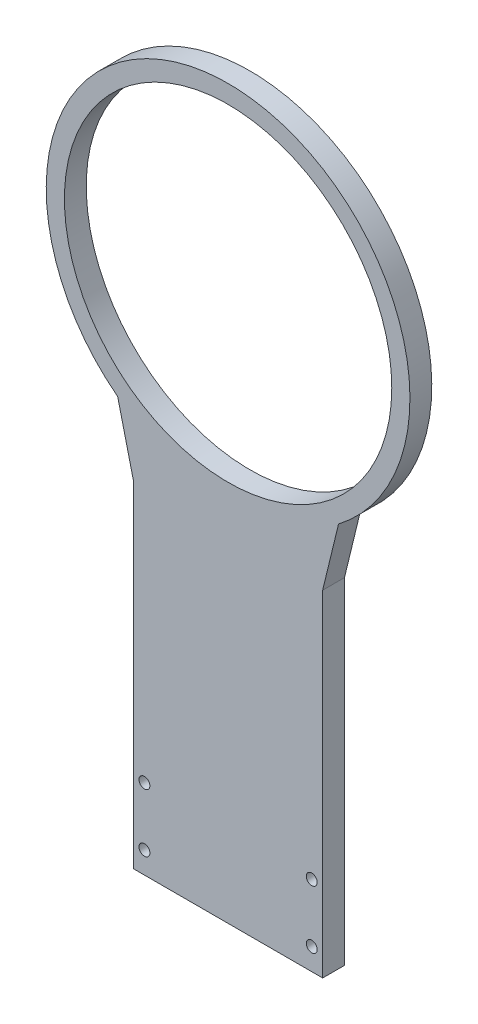
ISO-10303-21;
HEADER;
FILE_DESCRIPTION(('STEP AP214'),'2;1');
FILE_NAME('part.step','',(''),(''),'','','');
FILE_SCHEMA(('AUTOMOTIVE_DESIGN { 1 0 10303 214 1 1 1 1 }'));
ENDSEC;
DATA;
#1=APPLICATION_CONTEXT('core data for automotive mechanical design processes');
#2=APPLICATION_PROTOCOL_DEFINITION('international standard','automotive_design',2000,#1);
#3=PRODUCT_CONTEXT('',#1,'mechanical');
#4=PRODUCT('Part','Part','',(#3));
#5=PRODUCT_RELATED_PRODUCT_CATEGORY('part','',(#4));
#6=PRODUCT_DEFINITION_FORMATION('','',#4);
#7=PRODUCT_DEFINITION_CONTEXT('part definition',#1,'design');
#8=PRODUCT_DEFINITION('design','',#6,#7);
#9=PRODUCT_DEFINITION_SHAPE('','',#8);
#10=(LENGTH_UNIT() NAMED_UNIT(*) SI_UNIT(.MILLI.,.METRE.));
#11=(NAMED_UNIT(*) PLANE_ANGLE_UNIT() SI_UNIT($,.RADIAN.));
#12=(NAMED_UNIT(*) SI_UNIT($,.STERADIAN.) SOLID_ANGLE_UNIT());
#13=UNCERTAINTY_MEASURE_WITH_UNIT(LENGTH_MEASURE(1.E-05),#10,'distance_accuracy_value','');
#14=(GEOMETRIC_REPRESENTATION_CONTEXT(3) GLOBAL_UNCERTAINTY_ASSIGNED_CONTEXT((#13)) GLOBAL_UNIT_ASSIGNED_CONTEXT((#10,
#11,#12)) REPRESENTATION_CONTEXT('',''));
#15=CARTESIAN_POINT('',(0.,0.,0.));
#16=DIRECTION('',(0.,0.,1.));
#17=DIRECTION('',(1.,0.,0.));
#18=AXIS2_PLACEMENT_3D('',#15,#16,#17);
#19=CARTESIAN_POINT('',(0.,0.,6.));
#20=DIRECTION('',(0.,0.,-1.));
#21=DIRECTION('',(-1.,0.,0.));
#22=AXIS2_PLACEMENT_3D('',#19,#20,#21);
#23=PLANE('',#22);
#24=CARTESIAN_POINT('',(27.,-94.,6.));
#25=DIRECTION('',(0.,0.,1.));
#26=DIRECTION('',(1.,0.,0.));
#27=AXIS2_PLACEMENT_3D('',#24,#25,#26);
#28=CIRCLE('',#27,1.5);
#29=CARTESIAN_POINT('',(28.5,-94.,6.));
#30=VERTEX_POINT('',#29);
#31=EDGE_CURVE('E275',#30,#30,#28,.T.);
#32=ORIENTED_EDGE('',*,*,#31,.F.);
#33=EDGE_LOOP('',(#32));
#34=FACE_BOUND('',#33,.T.);
#35=CARTESIAN_POINT('',(73.,-94.,6.));
#36=DIRECTION('',(0.,0.,1.));
#37=DIRECTION('',(-1.,0.,0.));
#38=AXIS2_PLACEMENT_3D('',#35,#36,#37);
#39=CIRCLE('',#38,1.49999999999998);
#40=CARTESIAN_POINT('',(71.5,-94.,6.));
#41=VERTEX_POINT('',#40);
#42=EDGE_CURVE('E281',#41,#41,#39,.T.);
#43=ORIENTED_EDGE('',*,*,#42,.F.);
#44=EDGE_LOOP('',(#43));
#45=FACE_BOUND('',#44,.T.);
#46=CARTESIAN_POINT('',(73.,-78.,6.));
#47=DIRECTION('',(0.,0.,1.));
#48=DIRECTION('',(-1.,0.,0.));
#49=AXIS2_PLACEMENT_3D('',#46,#47,#48);
#50=CIRCLE('',#49,1.5);
#51=CARTESIAN_POINT('',(71.5,-78.,6.));
#52=VERTEX_POINT('',#51);
#53=EDGE_CURVE('E289',#52,#52,#50,.T.);
#54=ORIENTED_EDGE('',*,*,#53,.F.);
#55=EDGE_LOOP('',(#54));
#56=FACE_BOUND('',#55,.T.);
#57=CARTESIAN_POINT('',(27.,-78.,6.));
#58=DIRECTION('',(0.,0.,1.));
#59=DIRECTION('',(1.,0.,0.));
#60=AXIS2_PLACEMENT_3D('',#57,#58,#59);
#61=CIRCLE('',#60,1.5);
#62=CARTESIAN_POINT('',(28.5,-78.,6.));
#63=VERTEX_POINT('',#62);
#64=EDGE_CURVE('E278',#63,#63,#61,.T.);
#65=ORIENTED_EDGE('',*,*,#64,.F.);
#66=EDGE_LOOP('',(#65));
#67=FACE_BOUND('',#66,.T.);
#68=CARTESIAN_POINT('',(50.,50.,6.));
#69=DIRECTION('',(0.,0.,1.));
#70=DIRECTION('',(1.,0.,0.));
#71=AXIS2_PLACEMENT_3D('',#68,#69,#70);
#72=CIRCLE('',#71,45.);
#73=CARTESIAN_POINT('',(95.,50.,6.));
#74=VERTEX_POINT('',#73);
#75=EDGE_CURVE('E105',#74,#74,#72,.T.);
#76=ORIENTED_EDGE('',*,*,#75,.F.);
#77=EDGE_LOOP('',(#76));
#78=FACE_BOUND('',#77,.T.);
#79=CARTESIAN_POINT('',(50.,50.,6.));
#80=DIRECTION('',(0.,0.,-1.));
#81=DIRECTION('',(-1.,0.,0.));
#82=AXIS2_PLACEMENT_3D('',#79,#80,#81);
#83=CIRCLE('',#82,50.);
#84=CARTESIAN_POINT('',(19.6357645656102,10.2757856404315,6.));
#85=VERTEX_POINT('',#84);
#86=CARTESIAN_POINT('',(80.3642354343898,10.2757856404315,6.));
#87=VERTEX_POINT('',#86);
#88=EDGE_CURVE('E132',#85,#87,#83,.T.);
#89=ORIENTED_EDGE('',*,*,#88,.F.);
#90=DIRECTION('',(0.236291228604651,-0.971682281038666,0.));
#91=VECTOR('',#90,1.);
#92=CARTESIAN_POINT('',(20.8987506097563,5.08210508130589,6.));
#93=LINE('',#92,#91);
#94=CARTESIAN_POINT('',(24.,-7.67092472592289,6.));
#95=VERTEX_POINT('',#94);
#96=EDGE_CURVE('E126',#85,#95,#93,.T.);
#97=ORIENTED_EDGE('',*,*,#96,.T.);
#98=DIRECTION('',(0.,1.,0.));
#99=VECTOR('',#98,1.);
#100=CARTESIAN_POINT('',(24.,-100.,6.));
#101=LINE('',#100,#99);
#102=CARTESIAN_POINT('',(24.,-100.,6.));
#103=VERTEX_POINT('',#102);
#104=EDGE_CURVE('E100',#103,#95,#101,.T.);
#105=ORIENTED_EDGE('',*,*,#104,.F.);
#106=DIRECTION('',(1.,0.,0.));
#107=VECTOR('',#106,1.);
#108=CARTESIAN_POINT('',(0.,-100.,6.));
#109=LINE('',#108,#107);
#110=CARTESIAN_POINT('',(76.,-100.,6.));
#111=VERTEX_POINT('',#110);
#112=EDGE_CURVE('E106',#103,#111,#109,.T.);
#113=ORIENTED_EDGE('',*,*,#112,.T.);
#114=DIRECTION('',(0.,-1.,0.));
#115=VECTOR('',#114,1.);
#116=CARTESIAN_POINT('',(76.,-100.,6.));
#117=LINE('',#116,#115);
#118=CARTESIAN_POINT('',(76.,-7.67092472592279,6.));
#119=VERTEX_POINT('',#118);
#120=EDGE_CURVE('E92',#119,#111,#117,.T.);
#121=ORIENTED_EDGE('',*,*,#120,.F.);
#122=DIRECTION('',(0.23629122860465,0.971682281038666,0.));
#123=VECTOR('',#122,1.);
#124=CARTESIAN_POINT('',(73.5178949186942,-17.8778949186936,6.));
#125=LINE('',#124,#123);
#126=EDGE_CURVE('E41',#119,#87,#125,.T.);
#127=ORIENTED_EDGE('',*,*,#126,.T.);
#128=EDGE_LOOP('',(#89,#97,#105,#113,#121,#127));
#129=FACE_BOUND('',#128,.T.);
#130=ADVANCED_FACE('F33',(#34,#45,#56,#67,#78,#129),#23,.F.);
#131=CARTESIAN_POINT('',(0.,0.,0.));
#132=DIRECTION('',(0.,0.,-1.));
#133=DIRECTION('',(-1.,0.,0.));
#134=AXIS2_PLACEMENT_3D('',#131,#132,#133);
#135=PLANE('',#134);
#136=DIRECTION('',(0.,1.,0.));
#137=VECTOR('',#136,1.);
#138=CARTESIAN_POINT('',(24.,-100.,0.));
#139=LINE('',#138,#137);
#140=CARTESIAN_POINT('',(24.,-100.,0.));
#141=VERTEX_POINT('',#140);
#142=CARTESIAN_POINT('',(24.,-7.67092472592289,0.));
#143=VERTEX_POINT('',#142);
#144=EDGE_CURVE('E298',#141,#143,#139,.T.);
#145=ORIENTED_EDGE('',*,*,#144,.T.);
#146=DIRECTION('',(-0.236291228604651,0.971682281038666,0.));
#147=VECTOR('',#146,1.);
#148=CARTESIAN_POINT('',(19.6357645656102,10.2757856404315,0.));
#149=LINE('',#148,#147);
#150=CARTESIAN_POINT('',(19.6357645656102,10.2757856404315,0.));
#151=VERTEX_POINT('',#150);
#152=EDGE_CURVE('E128',#143,#151,#149,.T.);
#153=ORIENTED_EDGE('',*,*,#152,.T.);
#154=CARTESIAN_POINT('',(50.,50.,0.));
#155=DIRECTION('',(0.,0.,-1.));
#156=DIRECTION('',(-1.,0.,0.));
#157=AXIS2_PLACEMENT_3D('',#154,#155,#156);
#158=CIRCLE('',#157,50.);
#159=CARTESIAN_POINT('',(80.3642354343898,10.2757856404315,0.));
#160=VERTEX_POINT('',#159);
#161=EDGE_CURVE('E137',#151,#160,#158,.T.);
#162=ORIENTED_EDGE('',*,*,#161,.T.);
#163=DIRECTION('',(-0.23629122860465,-0.971682281038666,0.));
#164=VECTOR('',#163,1.);
#165=CARTESIAN_POINT('',(76.,-7.6709247259228,0.));
#166=LINE('',#165,#164);
#167=CARTESIAN_POINT('',(76.,-7.67092472592279,0.));
#168=VERTEX_POINT('',#167);
#169=EDGE_CURVE('E11',#160,#168,#166,.T.);
#170=ORIENTED_EDGE('',*,*,#169,.T.);
#171=DIRECTION('',(0.,-1.,0.));
#172=VECTOR('',#171,1.);
#173=CARTESIAN_POINT('',(76.,-100.,0.));
#174=LINE('',#173,#172);
#175=CARTESIAN_POINT('',(76.,-100.,0.));
#176=VERTEX_POINT('',#175);
#177=EDGE_CURVE('E83',#168,#176,#174,.T.);
#178=ORIENTED_EDGE('',*,*,#177,.T.);
#179=DIRECTION('',(1.,0.,0.));
#180=VECTOR('',#179,1.);
#181=CARTESIAN_POINT('',(0.,-100.,0.));
#182=LINE('',#181,#180);
#183=EDGE_CURVE('E89',#141,#176,#182,.T.);
#184=ORIENTED_EDGE('',*,*,#183,.F.);
#185=EDGE_LOOP('',(#145,#153,#162,#170,#178,#184));
#186=FACE_BOUND('',#185,.T.);
#187=CARTESIAN_POINT('',(27.,-94.,0.));
#188=DIRECTION('',(0.,0.,1.));
#189=DIRECTION('',(1.,0.,0.));
#190=AXIS2_PLACEMENT_3D('',#187,#188,#189);
#191=CIRCLE('',#190,1.5);
#192=CARTESIAN_POINT('',(28.5,-94.,0.));
#193=VERTEX_POINT('',#192);
#194=EDGE_CURVE('E273',#193,#193,#191,.T.);
#195=ORIENTED_EDGE('',*,*,#194,.T.);
#196=EDGE_LOOP('',(#195));
#197=FACE_BOUND('',#196,.T.);
#198=CARTESIAN_POINT('',(73.,-94.,0.));
#199=DIRECTION('',(0.,0.,1.));
#200=DIRECTION('',(-1.,0.,0.));
#201=AXIS2_PLACEMENT_3D('',#198,#199,#200);
#202=CIRCLE('',#201,1.49999999999998);
#203=CARTESIAN_POINT('',(71.5,-94.,0.));
#204=VERTEX_POINT('',#203);
#205=EDGE_CURVE('E276',#204,#204,#202,.T.);
#206=ORIENTED_EDGE('',*,*,#205,.T.);
#207=EDGE_LOOP('',(#206));
#208=FACE_BOUND('',#207,.T.);
#209=CARTESIAN_POINT('',(73.,-78.,0.));
#210=DIRECTION('',(0.,0.,1.));
#211=DIRECTION('',(-1.,0.,0.));
#212=AXIS2_PLACEMENT_3D('',#209,#210,#211);
#213=CIRCLE('',#212,1.5);
#214=CARTESIAN_POINT('',(71.5,-78.,0.));
#215=VERTEX_POINT('',#214);
#216=EDGE_CURVE('E286',#215,#215,#213,.T.);
#217=ORIENTED_EDGE('',*,*,#216,.T.);
#218=EDGE_LOOP('',(#217));
#219=FACE_BOUND('',#218,.T.);
#220=CARTESIAN_POINT('',(27.,-78.,0.));
#221=DIRECTION('',(0.,0.,1.));
#222=DIRECTION('',(1.,0.,0.));
#223=AXIS2_PLACEMENT_3D('',#220,#221,#222);
#224=CIRCLE('',#223,1.5);
#225=CARTESIAN_POINT('',(28.5,-78.,0.));
#226=VERTEX_POINT('',#225);
#227=EDGE_CURVE('E292',#226,#226,#224,.T.);
#228=ORIENTED_EDGE('',*,*,#227,.T.);
#229=EDGE_LOOP('',(#228));
#230=FACE_BOUND('',#229,.T.);
#231=CARTESIAN_POINT('',(50.,50.,0.));
#232=DIRECTION('',(0.,0.,1.));
#233=DIRECTION('',(1.,0.,0.));
#234=AXIS2_PLACEMENT_3D('',#231,#232,#233);
#235=CIRCLE('',#234,45.);
#236=CARTESIAN_POINT('',(95.,50.,0.));
#237=VERTEX_POINT('',#236);
#238=EDGE_CURVE('E109',#237,#237,#235,.T.);
#239=ORIENTED_EDGE('',*,*,#238,.T.);
#240=EDGE_LOOP('',(#239));
#241=FACE_BOUND('',#240,.T.);
#242=ADVANCED_FACE('F86',(#186,#197,#208,#219,#230,#241),#135,.T.);
#243=CARTESIAN_POINT('',(50.,50.,0.));
#244=DIRECTION('',(0.,0.,1.));
#245=DIRECTION('',(1.,0.,0.));
#246=AXIS2_PLACEMENT_3D('',#243,#244,#245);
#247=CYLINDRICAL_SURFACE('',#246,45.);
#248=ORIENTED_EDGE('',*,*,#238,.F.);
#249=EDGE_LOOP('',(#248));
#250=FACE_BOUND('',#249,.T.);
#251=ORIENTED_EDGE('',*,*,#75,.T.);
#252=EDGE_LOOP('',(#251));
#253=FACE_BOUND('',#252,.T.);
#254=ADVANCED_FACE('F151',(#250,#253),#247,.F.);
#255=CARTESIAN_POINT('',(0.,-100.,0.));
#256=DIRECTION('',(0.,-1.,0.));
#257=DIRECTION('',(0.,0.,-1.));
#258=AXIS2_PLACEMENT_3D('',#255,#256,#257);
#259=PLANE('',#258);
#260=DIRECTION('',(0.,0.,1.));
#261=VECTOR('',#260,1.);
#262=CARTESIAN_POINT('',(76.,-100.,0.));
#263=LINE('',#262,#261);
#264=EDGE_CURVE('E91',#176,#111,#263,.T.);
#265=ORIENTED_EDGE('',*,*,#264,.T.);
#266=ORIENTED_EDGE('',*,*,#112,.F.);
#267=DIRECTION('',(0.,0.,1.));
#268=VECTOR('',#267,1.);
#269=CARTESIAN_POINT('',(24.,-100.,0.));
#270=LINE('',#269,#268);
#271=EDGE_CURVE('E104',#141,#103,#270,.T.);
#272=ORIENTED_EDGE('',*,*,#271,.F.);
#273=ORIENTED_EDGE('',*,*,#183,.T.);
#274=EDGE_LOOP('',(#265,#266,#272,#273));
#275=FACE_BOUND('',#274,.T.);
#276=ADVANCED_FACE('F103',(#275),#259,.T.);
#277=CARTESIAN_POINT('',(24.,-100.,0.));
#278=DIRECTION('',(1.,0.,0.));
#279=DIRECTION('',(0.,0.,-1.));
#280=AXIS2_PLACEMENT_3D('',#277,#278,#279);
#281=PLANE('',#280);
#282=ORIENTED_EDGE('',*,*,#104,.T.);
#283=DIRECTION('',(0.,0.,-1.));
#284=VECTOR('',#283,1.);
#285=CARTESIAN_POINT('',(24.,-7.67092472592289,0.));
#286=LINE('',#285,#284);
#287=EDGE_CURVE('E122',#95,#143,#286,.T.);
#288=ORIENTED_EDGE('',*,*,#287,.T.);
#289=ORIENTED_EDGE('',*,*,#144,.F.);
#290=ORIENTED_EDGE('',*,*,#271,.T.);
#291=EDGE_LOOP('',(#282,#288,#289,#290));
#292=FACE_BOUND('',#291,.T.);
#293=ADVANCED_FACE('F161',(#292),#281,.F.);
#294=CARTESIAN_POINT('',(76.,-100.,0.));
#295=DIRECTION('',(-1.,0.,0.));
#296=DIRECTION('',(0.,0.,1.));
#297=AXIS2_PLACEMENT_3D('',#294,#295,#296);
#298=PLANE('',#297);
#299=ORIENTED_EDGE('',*,*,#177,.F.);
#300=DIRECTION('',(0.,0.,1.));
#301=VECTOR('',#300,1.);
#302=CARTESIAN_POINT('',(76.,-7.6709247259228,6.));
#303=LINE('',#302,#301);
#304=EDGE_CURVE('E124',#168,#119,#303,.T.);
#305=ORIENTED_EDGE('',*,*,#304,.T.);
#306=ORIENTED_EDGE('',*,*,#120,.T.);
#307=ORIENTED_EDGE('',*,*,#264,.F.);
#308=EDGE_LOOP('',(#299,#305,#306,#307));
#309=FACE_BOUND('',#308,.T.);
#310=ADVANCED_FACE('F95',(#309),#298,.F.);
#311=CARTESIAN_POINT('',(27.,-78.,0.));
#312=DIRECTION('',(0.,0.,1.));
#313=DIRECTION('',(1.,0.,0.));
#314=AXIS2_PLACEMENT_3D('',#311,#312,#313);
#315=CYLINDRICAL_SURFACE('',#314,1.5);
#316=ORIENTED_EDGE('',*,*,#227,.F.);
#317=EDGE_LOOP('',(#316));
#318=FACE_BOUND('',#317,.T.);
#319=ORIENTED_EDGE('',*,*,#64,.T.);
#320=EDGE_LOOP('',(#319));
#321=FACE_BOUND('',#320,.T.);
#322=ADVANCED_FACE('F167',(#318,#321),#315,.F.);
#323=CARTESIAN_POINT('',(73.,-78.,0.));
#324=DIRECTION('',(0.,0.,1.));
#325=DIRECTION('',(1.,0.,0.));
#326=AXIS2_PLACEMENT_3D('',#323,#324,#325);
#327=CYLINDRICAL_SURFACE('',#326,1.5);
#328=ORIENTED_EDGE('',*,*,#216,.F.);
#329=EDGE_LOOP('',(#328));
#330=FACE_BOUND('',#329,.T.);
#331=ORIENTED_EDGE('',*,*,#53,.T.);
#332=EDGE_LOOP('',(#331));
#333=FACE_BOUND('',#332,.T.);
#334=ADVANCED_FACE('F170',(#330,#333),#327,.F.);
#335=CARTESIAN_POINT('',(73.,-94.,0.));
#336=DIRECTION('',(0.,0.,1.));
#337=DIRECTION('',(1.,0.,0.));
#338=AXIS2_PLACEMENT_3D('',#335,#336,#337);
#339=CYLINDRICAL_SURFACE('',#338,1.49999999999998);
#340=ORIENTED_EDGE('',*,*,#205,.F.);
#341=EDGE_LOOP('',(#340));
#342=FACE_BOUND('',#341,.T.);
#343=ORIENTED_EDGE('',*,*,#42,.T.);
#344=EDGE_LOOP('',(#343));
#345=FACE_BOUND('',#344,.T.);
#346=ADVANCED_FACE('F174',(#342,#345),#339,.F.);
#347=CARTESIAN_POINT('',(27.,-94.,0.));
#348=DIRECTION('',(0.,0.,1.));
#349=DIRECTION('',(1.,0.,0.));
#350=AXIS2_PLACEMENT_3D('',#347,#348,#349);
#351=CYLINDRICAL_SURFACE('',#350,1.5);
#352=ORIENTED_EDGE('',*,*,#194,.F.);
#353=EDGE_LOOP('',(#352));
#354=FACE_BOUND('',#353,.T.);
#355=ORIENTED_EDGE('',*,*,#31,.T.);
#356=EDGE_LOOP('',(#355));
#357=FACE_BOUND('',#356,.T.);
#358=ADVANCED_FACE('F178',(#354,#357),#351,.F.);
#359=CARTESIAN_POINT('',(50.,50.,0.));
#360=DIRECTION('',(0.,0.,1.));
#361=DIRECTION('',(1.,0.,0.));
#362=AXIS2_PLACEMENT_3D('',#359,#360,#361);
#363=CYLINDRICAL_SURFACE('',#362,50.);
#364=ORIENTED_EDGE('',*,*,#161,.F.);
#365=DIRECTION('',(0.,0.,1.));
#366=VECTOR('',#365,1.);
#367=CARTESIAN_POINT('',(19.6357645656102,10.2757856404315,0.));
#368=LINE('',#367,#366);
#369=EDGE_CURVE('E119',#151,#85,#368,.T.);
#370=ORIENTED_EDGE('',*,*,#369,.T.);
#371=ORIENTED_EDGE('',*,*,#88,.T.);
#372=DIRECTION('',(0.,0.,1.));
#373=VECTOR('',#372,1.);
#374=CARTESIAN_POINT('',(80.3642354343898,10.2757856404315,0.));
#375=LINE('',#374,#373);
#376=EDGE_CURVE('E116',#87,#160,#375,.F.);
#377=ORIENTED_EDGE('',*,*,#376,.T.);
#378=EDGE_LOOP('',(#364,#370,#371,#377));
#379=FACE_BOUND('',#378,.T.);
#380=ADVANCED_FACE('F135',(#379),#363,.T.);
#381=CARTESIAN_POINT('',(19.6357645656102,10.2757856404315,0.));
#382=DIRECTION('',(0.971682281038666,0.236291228604651,0.));
#383=DIRECTION('',(0.,0.,1.));
#384=AXIS2_PLACEMENT_3D('',#381,#382,#383);
#385=PLANE('',#384);
#386=ORIENTED_EDGE('',*,*,#152,.F.);
#387=ORIENTED_EDGE('',*,*,#287,.F.);
#388=ORIENTED_EDGE('',*,*,#96,.F.);
#389=ORIENTED_EDGE('',*,*,#369,.F.);
#390=EDGE_LOOP('',(#386,#387,#388,#389));
#391=FACE_BOUND('',#390,.T.);
#392=ADVANCED_FACE('F140',(#391),#385,.F.);
#393=CARTESIAN_POINT('',(76.,-7.6709247259228,0.));
#394=DIRECTION('',(-0.971682281038666,0.23629122860465,0.));
#395=DIRECTION('',(0.,0.,1.));
#396=AXIS2_PLACEMENT_3D('',#393,#394,#395);
#397=PLANE('',#396);
#398=ORIENTED_EDGE('',*,*,#169,.F.);
#399=ORIENTED_EDGE('',*,*,#376,.F.);
#400=ORIENTED_EDGE('',*,*,#126,.F.);
#401=ORIENTED_EDGE('',*,*,#304,.F.);
#402=EDGE_LOOP('',(#398,#399,#400,#401));
#403=FACE_BOUND('',#402,.T.);
#404=ADVANCED_FACE('F35',(#403),#397,.F.);
#405=CLOSED_SHELL('',(#130,#242,#254,#276,#293,#310,#322,#334,#346,#358,#380,#392,#404));
#406=MANIFOLD_SOLID_BREP('B2',#405);
#407=ADVANCED_BREP_SHAPE_REPRESENTATION('',(#18,#406),#14);
#408=SHAPE_DEFINITION_REPRESENTATION(#9,#407);
ENDSEC;
END-ISO-10303-21;
